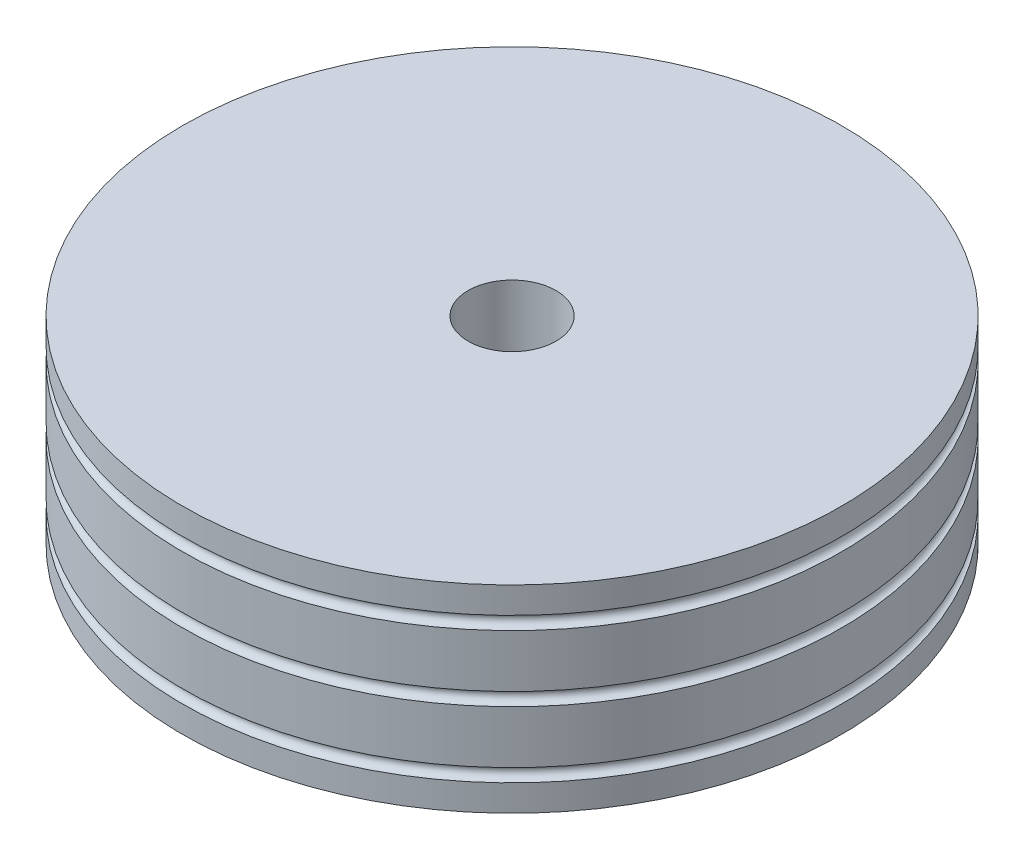
ISO-10303-21;
HEADER;
FILE_DESCRIPTION(('STEP AP214'),'2;1');
FILE_NAME('part.step','',(''),(''),'','','');
FILE_SCHEMA(('AUTOMOTIVE_DESIGN { 1 0 10303 214 1 1 1 1 }'));
ENDSEC;
DATA;
#1=APPLICATION_CONTEXT('core data for automotive mechanical design processes');
#2=APPLICATION_PROTOCOL_DEFINITION('international standard','automotive_design',2000,#1);
#3=PRODUCT_CONTEXT('',#1,'mechanical');
#4=PRODUCT('Part','Part','',(#3));
#5=PRODUCT_RELATED_PRODUCT_CATEGORY('part','',(#4));
#6=PRODUCT_DEFINITION_FORMATION('','',#4);
#7=PRODUCT_DEFINITION_CONTEXT('part definition',#1,'design');
#8=PRODUCT_DEFINITION('design','',#6,#7);
#9=PRODUCT_DEFINITION_SHAPE('','',#8);
#10=(LENGTH_UNIT() NAMED_UNIT(*) SI_UNIT(.MILLI.,.METRE.));
#11=(NAMED_UNIT(*) PLANE_ANGLE_UNIT() SI_UNIT($,.RADIAN.));
#12=(NAMED_UNIT(*) SI_UNIT($,.STERADIAN.) SOLID_ANGLE_UNIT());
#13=UNCERTAINTY_MEASURE_WITH_UNIT(LENGTH_MEASURE(1.E-05),#10,'distance_accuracy_value','');
#14=(GEOMETRIC_REPRESENTATION_CONTEXT(3) GLOBAL_UNCERTAINTY_ASSIGNED_CONTEXT((#13)) GLOBAL_UNIT_ASSIGNED_CONTEXT((#10,
#11,#12)) REPRESENTATION_CONTEXT('',''));
#15=CARTESIAN_POINT('',(0.,0.,0.));
#16=DIRECTION('',(0.,0.,1.));
#17=DIRECTION('',(1.,0.,0.));
#18=AXIS2_PLACEMENT_3D('',#15,#16,#17);
#19=CARTESIAN_POINT('',(15.,-4.5,0.));
#20=DIRECTION('',(0.,1.,0.));
#21=DIRECTION('',(-1.,0.,0.));
#22=AXIS2_PLACEMENT_3D('',#19,#20,#21);
#23=PLANE('',#22);
#24=CARTESIAN_POINT('',(0.,-4.5,0.));
#25=DIRECTION('',(0.,-1.,0.));
#26=DIRECTION('',(1.,0.,0.));
#27=AXIS2_PLACEMENT_3D('',#24,#25,#26);
#28=CIRCLE('',#27,3.);
#29=CARTESIAN_POINT('',(3.,-4.5,0.));
#30=VERTEX_POINT('',#29);
#31=EDGE_CURVE('E73',#30,#30,#28,.T.);
#32=ORIENTED_EDGE('',*,*,#31,.F.);
#33=EDGE_LOOP('',(#32));
#34=FACE_BOUND('',#33,.T.);
#35=CARTESIAN_POINT('',(0.,-4.5,0.));
#36=DIRECTION('',(0.,1.,0.));
#37=DIRECTION('',(-1.,0.,0.));
#38=AXIS2_PLACEMENT_3D('',#35,#36,#37);
#39=CIRCLE('',#38,15.);
#40=CARTESIAN_POINT('',(-15.,-4.50000000000001,0.));
#41=VERTEX_POINT('',#40);
#42=EDGE_CURVE('E10',#41,#41,#39,.T.);
#43=ORIENTED_EDGE('',*,*,#42,.F.);
#44=EDGE_LOOP('',(#43));
#45=FACE_BOUND('',#44,.T.);
#46=ADVANCED_FACE('F40',(#34,#45),#23,.F.);
#47=CARTESIAN_POINT('',(0.,4.5,0.));
#48=DIRECTION('',(0.,1.,0.));
#49=DIRECTION('',(-1.,0.,0.));
#50=AXIS2_PLACEMENT_3D('',#47,#48,#49);
#51=CYLINDRICAL_SURFACE('',#50,15.);
#52=CARTESIAN_POINT('',(0.,-3.3,0.));
#53=DIRECTION('',(0.,1.,0.));
#54=DIRECTION('',(-1.,0.,0.));
#55=AXIS2_PLACEMENT_3D('',#52,#53,#54);
#56=CIRCLE('',#55,15.);
#57=CARTESIAN_POINT('',(-15.,-3.30000000000001,0.));
#58=VERTEX_POINT('',#57);
#59=EDGE_CURVE('E43',#58,#58,#56,.T.);
#60=ORIENTED_EDGE('',*,*,#59,.F.);
#61=EDGE_LOOP('',(#60));
#62=FACE_BOUND('',#61,.T.);
#63=ORIENTED_EDGE('',*,*,#42,.T.);
#64=EDGE_LOOP('',(#63));
#65=FACE_BOUND('',#64,.T.);
#66=ADVANCED_FACE('F95',(#62,#65),#51,.T.);
#67=CARTESIAN_POINT('',(0.,-3.,0.));
#68=DIRECTION('',(0.,1.,0.));
#69=DIRECTION('',(-1.,0.,0.));
#70=AXIS2_PLACEMENT_3D('',#67,#68,#69);
#71=TOROIDAL_SURFACE('',#70,15.,0.299999999999998);
#72=CARTESIAN_POINT('',(0.,-2.7,0.));
#73=DIRECTION('',(0.,1.,0.));
#74=DIRECTION('',(-1.,0.,0.));
#75=AXIS2_PLACEMENT_3D('',#72,#73,#74);
#76=CIRCLE('',#75,15.);
#77=CARTESIAN_POINT('',(-15.,-2.70000000000001,0.));
#78=VERTEX_POINT('',#77);
#79=EDGE_CURVE('E50',#78,#78,#76,.T.);
#80=ORIENTED_EDGE('',*,*,#79,.F.);
#81=EDGE_LOOP('',(#80));
#82=FACE_BOUND('',#81,.T.);
#83=ORIENTED_EDGE('',*,*,#59,.T.);
#84=EDGE_LOOP('',(#83));
#85=FACE_BOUND('',#84,.T.);
#86=ADVANCED_FACE('F98',(#82,#85),#71,.F.);
#87=CARTESIAN_POINT('',(0.,4.5,0.));
#88=DIRECTION('',(0.,1.,0.));
#89=DIRECTION('',(-1.,0.,0.));
#90=AXIS2_PLACEMENT_3D('',#87,#88,#89);
#91=CYLINDRICAL_SURFACE('',#90,15.);
#92=CARTESIAN_POINT('',(0.,-0.300000000000004,0.));
#93=DIRECTION('',(0.,1.,0.));
#94=DIRECTION('',(-1.,0.,0.));
#95=AXIS2_PLACEMENT_3D('',#92,#93,#94);
#96=CIRCLE('',#95,15.);
#97=CARTESIAN_POINT('',(-15.,-0.300000000000009,0.));
#98=VERTEX_POINT('',#97);
#99=EDGE_CURVE('E51',#98,#98,#96,.T.);
#100=ORIENTED_EDGE('',*,*,#99,.F.);
#101=EDGE_LOOP('',(#100));
#102=FACE_BOUND('',#101,.T.);
#103=ORIENTED_EDGE('',*,*,#79,.T.);
#104=EDGE_LOOP('',(#103));
#105=FACE_BOUND('',#104,.T.);
#106=ADVANCED_FACE('F103',(#102,#105),#91,.T.);
#107=CARTESIAN_POINT('',(0.,0.,0.));
#108=DIRECTION('',(0.,1.,0.));
#109=DIRECTION('',(-1.,0.,0.));
#110=AXIS2_PLACEMENT_3D('',#107,#108,#109);
#111=TOROIDAL_SURFACE('',#110,15.,0.3);
#112=CARTESIAN_POINT('',(0.,0.299999999999996,0.));
#113=DIRECTION('',(0.,1.,0.));
#114=DIRECTION('',(-1.,0.,0.));
#115=AXIS2_PLACEMENT_3D('',#112,#113,#114);
#116=CIRCLE('',#115,15.);
#117=CARTESIAN_POINT('',(-15.,0.299999999999991,0.));
#118=VERTEX_POINT('',#117);
#119=EDGE_CURVE('E57',#118,#118,#116,.T.);
#120=ORIENTED_EDGE('',*,*,#119,.F.);
#121=EDGE_LOOP('',(#120));
#122=FACE_BOUND('',#121,.T.);
#123=ORIENTED_EDGE('',*,*,#99,.T.);
#124=EDGE_LOOP('',(#123));
#125=FACE_BOUND('',#124,.T.);
#126=ADVANCED_FACE('F108',(#122,#125),#111,.F.);
#127=CARTESIAN_POINT('',(0.,4.5,0.));
#128=DIRECTION('',(0.,1.,0.));
#129=DIRECTION('',(-1.,0.,0.));
#130=AXIS2_PLACEMENT_3D('',#127,#128,#129);
#131=CYLINDRICAL_SURFACE('',#130,15.);
#132=CARTESIAN_POINT('',(0.,2.7,0.));
#133=DIRECTION('',(0.,1.,0.));
#134=DIRECTION('',(-1.,0.,0.));
#135=AXIS2_PLACEMENT_3D('',#132,#133,#134);
#136=CIRCLE('',#135,15.);
#137=CARTESIAN_POINT('',(-15.,2.69999999999999,0.));
#138=VERTEX_POINT('',#137);
#139=EDGE_CURVE('E56',#138,#138,#136,.T.);
#140=ORIENTED_EDGE('',*,*,#139,.F.);
#141=EDGE_LOOP('',(#140));
#142=FACE_BOUND('',#141,.T.);
#143=ORIENTED_EDGE('',*,*,#119,.T.);
#144=EDGE_LOOP('',(#143));
#145=FACE_BOUND('',#144,.T.);
#146=ADVANCED_FACE('F114',(#142,#145),#131,.T.);
#147=CARTESIAN_POINT('',(0.,3.,0.));
#148=DIRECTION('',(0.,1.,0.));
#149=DIRECTION('',(-1.,0.,0.));
#150=AXIS2_PLACEMENT_3D('',#147,#148,#149);
#151=TOROIDAL_SURFACE('',#150,15.,0.3);
#152=CARTESIAN_POINT('',(0.,3.3,0.));
#153=DIRECTION('',(0.,1.,0.));
#154=DIRECTION('',(-1.,0.,0.));
#155=AXIS2_PLACEMENT_3D('',#152,#153,#154);
#156=CIRCLE('',#155,15.);
#157=CARTESIAN_POINT('',(-15.,3.29999999999999,0.));
#158=VERTEX_POINT('',#157);
#159=EDGE_CURVE('E65',#158,#158,#156,.T.);
#160=ORIENTED_EDGE('',*,*,#159,.F.);
#161=EDGE_LOOP('',(#160));
#162=FACE_BOUND('',#161,.T.);
#163=ORIENTED_EDGE('',*,*,#139,.T.);
#164=EDGE_LOOP('',(#163));
#165=FACE_BOUND('',#164,.T.);
#166=ADVANCED_FACE('F120',(#162,#165),#151,.F.);
#167=CARTESIAN_POINT('',(0.,4.5,0.));
#168=DIRECTION('',(0.,1.,0.));
#169=DIRECTION('',(-1.,0.,0.));
#170=AXIS2_PLACEMENT_3D('',#167,#168,#169);
#171=CYLINDRICAL_SURFACE('',#170,15.);
#172=CARTESIAN_POINT('',(0.,4.5,0.));
#173=DIRECTION('',(0.,1.,0.));
#174=DIRECTION('',(-1.,0.,0.));
#175=AXIS2_PLACEMENT_3D('',#172,#173,#174);
#176=CIRCLE('',#175,15.);
#177=CARTESIAN_POINT('',(-15.,4.49999999999999,0.));
#178=VERTEX_POINT('',#177);
#179=EDGE_CURVE('E64',#178,#178,#176,.T.);
#180=ORIENTED_EDGE('',*,*,#179,.F.);
#181=EDGE_LOOP('',(#180));
#182=FACE_BOUND('',#181,.T.);
#183=ORIENTED_EDGE('',*,*,#159,.T.);
#184=EDGE_LOOP('',(#183));
#185=FACE_BOUND('',#184,.T.);
#186=ADVANCED_FACE('F121',(#182,#185),#171,.T.);
#187=CARTESIAN_POINT('',(0.,4.5,0.));
#188=DIRECTION('',(0.,-1.,0.));
#189=DIRECTION('',(1.,0.,0.));
#190=AXIS2_PLACEMENT_3D('',#187,#188,#189);
#191=PLANE('',#190);
#192=CARTESIAN_POINT('',(0.,4.5,0.));
#193=DIRECTION('',(0.,1.,0.));
#194=DIRECTION('',(-1.,0.,0.));
#195=AXIS2_PLACEMENT_3D('',#192,#193,#194);
#196=CIRCLE('',#195,2.);
#197=CARTESIAN_POINT('',(-2.,4.5,0.));
#198=VERTEX_POINT('',#197);
#199=EDGE_CURVE('E69',#198,#198,#196,.T.);
#200=ORIENTED_EDGE('',*,*,#199,.F.);
#201=EDGE_LOOP('',(#200));
#202=FACE_BOUND('',#201,.T.);
#203=ORIENTED_EDGE('',*,*,#179,.T.);
#204=EDGE_LOOP('',(#203));
#205=FACE_BOUND('',#204,.T.);
#206=ADVANCED_FACE('F125',(#202,#205),#191,.F.);
#207=CARTESIAN_POINT('',(0.,-1.5,0.));
#208=DIRECTION('',(0.,1.,0.));
#209=DIRECTION('',(-1.,0.,0.));
#210=AXIS2_PLACEMENT_3D('',#207,#208,#209);
#211=CYLINDRICAL_SURFACE('',#210,2.);
#212=CARTESIAN_POINT('',(0.,-1.5,0.));
#213=DIRECTION('',(0.,1.,0.));
#214=DIRECTION('',(-1.,0.,0.));
#215=AXIS2_PLACEMENT_3D('',#212,#213,#214);
#216=CIRCLE('',#215,2.);
#217=CARTESIAN_POINT('',(-2.,-1.5,0.));
#218=VERTEX_POINT('',#217);
#219=EDGE_CURVE('E72',#218,#218,#216,.T.);
#220=ORIENTED_EDGE('',*,*,#219,.F.);
#221=EDGE_LOOP('',(#220));
#222=FACE_BOUND('',#221,.T.);
#223=ORIENTED_EDGE('',*,*,#199,.T.);
#224=EDGE_LOOP('',(#223));
#225=FACE_BOUND('',#224,.T.);
#226=ADVANCED_FACE('F129',(#222,#225),#211,.F.);
#227=CARTESIAN_POINT('',(0.,-1.5,0.));
#228=DIRECTION('',(0.,-1.,0.));
#229=DIRECTION('',(1.,0.,0.));
#230=AXIS2_PLACEMENT_3D('',#227,#228,#229);
#231=PLANE('',#230);
#232=CARTESIAN_POINT('',(0.,-1.5,0.));
#233=DIRECTION('',(0.,-1.,0.));
#234=DIRECTION('',(1.,0.,0.));
#235=AXIS2_PLACEMENT_3D('',#232,#233,#234);
#236=CIRCLE('',#235,3.);
#237=CARTESIAN_POINT('',(3.,-1.5,0.));
#238=VERTEX_POINT('',#237);
#239=EDGE_CURVE('E74',#238,#238,#236,.T.);
#240=ORIENTED_EDGE('',*,*,#239,.T.);
#241=EDGE_LOOP('',(#240));
#242=FACE_BOUND('',#241,.T.);
#243=ORIENTED_EDGE('',*,*,#219,.T.);
#244=EDGE_LOOP('',(#243));
#245=FACE_BOUND('',#244,.T.);
#246=ADVANCED_FACE('F81',(#242,#245),#231,.T.);
#247=CARTESIAN_POINT('',(0.,-1.5,0.));
#248=DIRECTION('',(0.,-1.,0.));
#249=DIRECTION('',(1.,0.,0.));
#250=AXIS2_PLACEMENT_3D('',#247,#248,#249);
#251=CYLINDRICAL_SURFACE('',#250,3.);
#252=ORIENTED_EDGE('',*,*,#239,.F.);
#253=EDGE_LOOP('',(#252));
#254=FACE_BOUND('',#253,.T.);
#255=ORIENTED_EDGE('',*,*,#31,.T.);
#256=EDGE_LOOP('',(#255));
#257=FACE_BOUND('',#256,.T.);
#258=ADVANCED_FACE('F83',(#254,#257),#251,.F.);
#259=CLOSED_SHELL('',(#46,#66,#86,#106,#126,#146,#166,#186,#206,#226,#246,#258));
#260=MANIFOLD_SOLID_BREP('B2',#259);
#261=ADVANCED_BREP_SHAPE_REPRESENTATION('',(#18,#260),#14);
#262=SHAPE_DEFINITION_REPRESENTATION(#9,#261);
ENDSEC;
END-ISO-10303-21;
